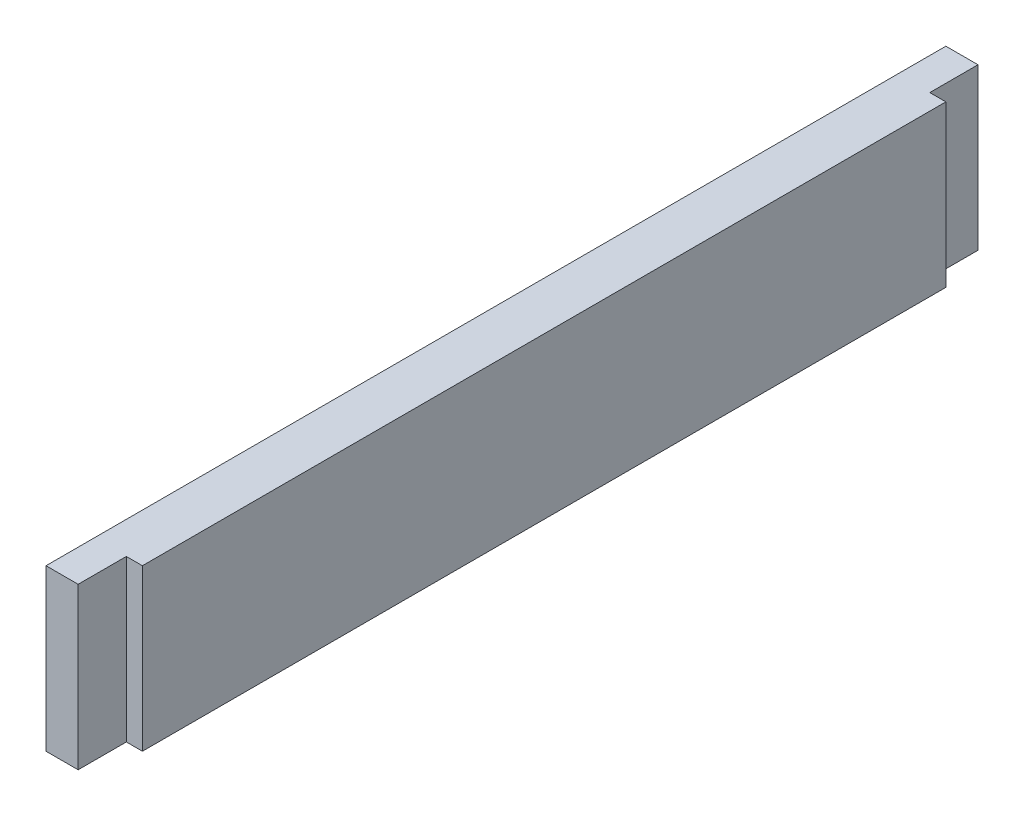
ISO-10303-21;
HEADER;
FILE_DESCRIPTION(('STEP AP214'),'2;1');
FILE_NAME('part.step','',(''),(''),'','','');
FILE_SCHEMA(('AUTOMOTIVE_DESIGN { 1 0 10303 214 1 1 1 1 }'));
ENDSEC;
DATA;
#1=APPLICATION_CONTEXT('core data for automotive mechanical design processes');
#2=APPLICATION_PROTOCOL_DEFINITION('international standard','automotive_design',2000,#1);
#3=PRODUCT_CONTEXT('',#1,'mechanical');
#4=PRODUCT('Part','Part','',(#3));
#5=PRODUCT_RELATED_PRODUCT_CATEGORY('part','',(#4));
#6=PRODUCT_DEFINITION_FORMATION('','',#4);
#7=PRODUCT_DEFINITION_CONTEXT('part definition',#1,'design');
#8=PRODUCT_DEFINITION('design','',#6,#7);
#9=PRODUCT_DEFINITION_SHAPE('','',#8);
#10=(LENGTH_UNIT() NAMED_UNIT(*) SI_UNIT(.MILLI.,.METRE.));
#11=(NAMED_UNIT(*) PLANE_ANGLE_UNIT() SI_UNIT($,.RADIAN.));
#12=(NAMED_UNIT(*) SI_UNIT($,.STERADIAN.) SOLID_ANGLE_UNIT());
#13=UNCERTAINTY_MEASURE_WITH_UNIT(LENGTH_MEASURE(1.E-05),#10,'distance_accuracy_value','');
#14=(GEOMETRIC_REPRESENTATION_CONTEXT(3) GLOBAL_UNCERTAINTY_ASSIGNED_CONTEXT((#13)) GLOBAL_UNIT_ASSIGNED_CONTEXT((#10,
#11,#12)) REPRESENTATION_CONTEXT('',''));
#15=CARTESIAN_POINT('',(0.,0.,0.));
#16=DIRECTION('',(0.,0.,1.));
#17=DIRECTION('',(1.,0.,0.));
#18=AXIS2_PLACEMENT_3D('',#15,#16,#17);
#19=CARTESIAN_POINT('',(-171.45,15.875,-88.9));
#20=DIRECTION('',(0.,0.,1.));
#21=DIRECTION('',(1.,0.,0.));
#22=AXIS2_PLACEMENT_3D('',#19,#20,#21);
#23=PLANE('',#22);
#24=DIRECTION('',(0.,-1.,0.));
#25=VECTOR('',#24,1.);
#26=CARTESIAN_POINT('',(-165.1,15.875,-88.9));
#27=LINE('',#26,#25);
#28=CARTESIAN_POINT('',(-165.1,15.875,-88.9));
#29=VERTEX_POINT('',#28);
#30=CARTESIAN_POINT('',(-165.1,-15.875,-88.9));
#31=VERTEX_POINT('',#30);
#32=EDGE_CURVE('E117',#29,#31,#27,.T.);
#33=ORIENTED_EDGE('',*,*,#32,.T.);
#34=DIRECTION('',(-1.,0.,0.));
#35=VECTOR('',#34,1.);
#36=CARTESIAN_POINT('',(-171.45,-15.875,-88.9));
#37=LINE('',#36,#35);
#38=CARTESIAN_POINT('',(-171.45,-15.875,-88.9));
#39=VERTEX_POINT('',#38);
#40=EDGE_CURVE('E111',#31,#39,#37,.T.);
#41=ORIENTED_EDGE('',*,*,#40,.T.);
#42=DIRECTION('',(0.,-1.,0.));
#43=VECTOR('',#42,1.);
#44=CARTESIAN_POINT('',(-171.45,15.875,-88.9));
#45=LINE('',#44,#43);
#46=CARTESIAN_POINT('',(-171.45,15.875,-88.9));
#47=VERTEX_POINT('',#46);
#48=EDGE_CURVE('E11',#47,#39,#45,.T.);
#49=ORIENTED_EDGE('',*,*,#48,.F.);
#50=DIRECTION('',(-1.,0.,0.));
#51=VECTOR('',#50,1.);
#52=CARTESIAN_POINT('',(-171.45,15.875,-88.9));
#53=LINE('',#52,#51);
#54=EDGE_CURVE('E135',#29,#47,#53,.T.);
#55=ORIENTED_EDGE('',*,*,#54,.F.);
#56=EDGE_LOOP('',(#33,#41,#49,#55));
#57=FACE_BOUND('',#56,.T.);
#58=ADVANCED_FACE('F35',(#57),#23,.F.);
#59=CARTESIAN_POINT('',(-171.45,15.875,-88.9));
#60=DIRECTION('',(1.,0.,0.));
#61=DIRECTION('',(0.,0.,-1.));
#62=AXIS2_PLACEMENT_3D('',#59,#60,#61);
#63=PLANE('',#62);
#64=ORIENTED_EDGE('',*,*,#48,.T.);
#65=DIRECTION('',(0.,0.,1.));
#66=VECTOR('',#65,1.);
#67=CARTESIAN_POINT('',(-171.45,-15.875,-88.9));
#68=LINE('',#67,#66);
#69=CARTESIAN_POINT('',(-171.45,-15.875,88.9));
#70=VERTEX_POINT('',#69);
#71=EDGE_CURVE('E101',#39,#70,#68,.T.);
#72=ORIENTED_EDGE('',*,*,#71,.T.);
#73=DIRECTION('',(0.,-1.,0.));
#74=VECTOR('',#73,1.);
#75=CARTESIAN_POINT('',(-171.45,15.875,88.9));
#76=LINE('',#75,#74);
#77=CARTESIAN_POINT('',(-171.45,15.875,88.9));
#78=VERTEX_POINT('',#77);
#79=EDGE_CURVE('E42',#78,#70,#76,.T.);
#80=ORIENTED_EDGE('',*,*,#79,.F.);
#81=DIRECTION('',(0.,0.,1.));
#82=VECTOR('',#81,1.);
#83=CARTESIAN_POINT('',(-171.45,15.875,-88.9));
#84=LINE('',#83,#82);
#85=EDGE_CURVE('E102',#47,#78,#84,.T.);
#86=ORIENTED_EDGE('',*,*,#85,.F.);
#87=EDGE_LOOP('',(#64,#72,#80,#86));
#88=FACE_BOUND('',#87,.T.);
#89=ADVANCED_FACE('F99',(#88),#63,.F.);
#90=CARTESIAN_POINT('',(-165.1,15.875,88.9));
#91=DIRECTION('',(0.,0.,-1.));
#92=DIRECTION('',(-1.,0.,0.));
#93=AXIS2_PLACEMENT_3D('',#90,#91,#92);
#94=PLANE('',#93);
#95=ORIENTED_EDGE('',*,*,#79,.T.);
#96=DIRECTION('',(1.,0.,0.));
#97=VECTOR('',#96,1.);
#98=CARTESIAN_POINT('',(-165.1,-15.875,88.9));
#99=LINE('',#98,#97);
#100=CARTESIAN_POINT('',(-165.1,-15.875,88.9));
#101=VERTEX_POINT('',#100);
#102=EDGE_CURVE('E115',#70,#101,#99,.T.);
#103=ORIENTED_EDGE('',*,*,#102,.T.);
#104=DIRECTION('',(0.,-1.,0.));
#105=VECTOR('',#104,1.);
#106=CARTESIAN_POINT('',(-165.1,15.875,88.9));
#107=LINE('',#106,#105);
#108=CARTESIAN_POINT('',(-165.1,15.875,88.9));
#109=VERTEX_POINT('',#108);
#110=EDGE_CURVE('E157',#109,#101,#107,.T.);
#111=ORIENTED_EDGE('',*,*,#110,.F.);
#112=DIRECTION('',(1.,0.,0.));
#113=VECTOR('',#112,1.);
#114=CARTESIAN_POINT('',(-165.1,15.875,88.9));
#115=LINE('',#114,#113);
#116=EDGE_CURVE('E138',#78,#109,#115,.T.);
#117=ORIENTED_EDGE('',*,*,#116,.F.);
#118=EDGE_LOOP('',(#95,#103,#111,#117));
#119=FACE_BOUND('',#118,.T.);
#120=ADVANCED_FACE('F160',(#119),#94,.F.);
#121=CARTESIAN_POINT('',(-165.1,15.875,79.375));
#122=DIRECTION('',(-1.,0.,0.));
#123=DIRECTION('',(0.,0.,1.));
#124=AXIS2_PLACEMENT_3D('',#121,#122,#123);
#125=PLANE('',#124);
#126=ORIENTED_EDGE('',*,*,#110,.T.);
#127=DIRECTION('',(0.,0.,-1.));
#128=VECTOR('',#127,1.);
#129=CARTESIAN_POINT('',(-165.1,-15.875,79.375));
#130=LINE('',#129,#128);
#131=CARTESIAN_POINT('',(-165.1,-15.875,79.375));
#132=VERTEX_POINT('',#131);
#133=EDGE_CURVE('E121',#101,#132,#130,.T.);
#134=ORIENTED_EDGE('',*,*,#133,.T.);
#135=DIRECTION('',(0.,-1.,0.));
#136=VECTOR('',#135,1.);
#137=CARTESIAN_POINT('',(-165.1,15.875,79.375));
#138=LINE('',#137,#136);
#139=CARTESIAN_POINT('',(-165.1,15.875,79.375));
#140=VERTEX_POINT('',#139);
#141=EDGE_CURVE('E155',#140,#132,#138,.T.);
#142=ORIENTED_EDGE('',*,*,#141,.F.);
#143=DIRECTION('',(0.,0.,-1.));
#144=VECTOR('',#143,1.);
#145=CARTESIAN_POINT('',(-165.1,15.875,79.375));
#146=LINE('',#145,#144);
#147=EDGE_CURVE('E140',#109,#140,#146,.T.);
#148=ORIENTED_EDGE('',*,*,#147,.F.);
#149=EDGE_LOOP('',(#126,#134,#142,#148));
#150=FACE_BOUND('',#149,.T.);
#151=ADVANCED_FACE('F168',(#150),#125,.F.);
#152=CARTESIAN_POINT('',(-161.925,15.875,79.375));
#153=DIRECTION('',(0.,0.,-1.));
#154=DIRECTION('',(-1.,0.,0.));
#155=AXIS2_PLACEMENT_3D('',#152,#153,#154);
#156=PLANE('',#155);
#157=ORIENTED_EDGE('',*,*,#141,.T.);
#158=DIRECTION('',(1.,0.,0.));
#159=VECTOR('',#158,1.);
#160=CARTESIAN_POINT('',(-161.925,-15.875,79.375));
#161=LINE('',#160,#159);
#162=CARTESIAN_POINT('',(-161.925,-15.875,79.375));
#163=VERTEX_POINT('',#162);
#164=EDGE_CURVE('E124',#132,#163,#161,.T.);
#165=ORIENTED_EDGE('',*,*,#164,.T.);
#166=DIRECTION('',(0.,-1.,0.));
#167=VECTOR('',#166,1.);
#168=CARTESIAN_POINT('',(-161.925,15.875,79.375));
#169=LINE('',#168,#167);
#170=CARTESIAN_POINT('',(-161.925,15.875,79.375));
#171=VERTEX_POINT('',#170);
#172=EDGE_CURVE('E153',#171,#163,#169,.T.);
#173=ORIENTED_EDGE('',*,*,#172,.F.);
#174=DIRECTION('',(1.,0.,0.));
#175=VECTOR('',#174,1.);
#176=CARTESIAN_POINT('',(-161.925,15.875,79.375));
#177=LINE('',#176,#175);
#178=EDGE_CURVE('E142',#140,#171,#177,.T.);
#179=ORIENTED_EDGE('',*,*,#178,.F.);
#180=EDGE_LOOP('',(#157,#165,#173,#179));
#181=FACE_BOUND('',#180,.T.);
#182=ADVANCED_FACE('F171',(#181),#156,.F.);
#183=CARTESIAN_POINT('',(-161.925,15.875,-79.375));
#184=DIRECTION('',(-1.,0.,0.));
#185=DIRECTION('',(0.,0.,1.));
#186=AXIS2_PLACEMENT_3D('',#183,#184,#185);
#187=PLANE('',#186);
#188=ORIENTED_EDGE('',*,*,#172,.T.);
#189=DIRECTION('',(0.,0.,-1.));
#190=VECTOR('',#189,1.);
#191=CARTESIAN_POINT('',(-161.925,-15.875,-25.4));
#192=LINE('',#191,#190);
#193=CARTESIAN_POINT('',(-161.925,-15.875,-79.375));
#194=VERTEX_POINT('',#193);
#195=EDGE_CURVE('E127',#163,#194,#192,.T.);
#196=ORIENTED_EDGE('',*,*,#195,.T.);
#197=DIRECTION('',(0.,-1.,0.));
#198=VECTOR('',#197,1.);
#199=CARTESIAN_POINT('',(-161.925,15.875,-79.375));
#200=LINE('',#199,#198);
#201=CARTESIAN_POINT('',(-161.925,15.875,-79.375));
#202=VERTEX_POINT('',#201);
#203=EDGE_CURVE('E151',#202,#194,#200,.T.);
#204=ORIENTED_EDGE('',*,*,#203,.F.);
#205=DIRECTION('',(0.,0.,-1.));
#206=VECTOR('',#205,1.);
#207=CARTESIAN_POINT('',(-161.925,15.875,-25.4));
#208=LINE('',#207,#206);
#209=EDGE_CURVE('E144',#171,#202,#208,.T.);
#210=ORIENTED_EDGE('',*,*,#209,.F.);
#211=EDGE_LOOP('',(#188,#196,#204,#210));
#212=FACE_BOUND('',#211,.T.);
#213=ADVANCED_FACE('F176',(#212),#187,.F.);
#214=CARTESIAN_POINT('',(-165.1,15.875,-79.375));
#215=DIRECTION('',(0.,0.,1.));
#216=DIRECTION('',(1.,0.,0.));
#217=AXIS2_PLACEMENT_3D('',#214,#215,#216);
#218=PLANE('',#217);
#219=ORIENTED_EDGE('',*,*,#203,.T.);
#220=DIRECTION('',(-1.,0.,0.));
#221=VECTOR('',#220,1.);
#222=CARTESIAN_POINT('',(-165.1,-15.875,-79.375));
#223=LINE('',#222,#221);
#224=CARTESIAN_POINT('',(-165.1,-15.875,-79.375));
#225=VERTEX_POINT('',#224);
#226=EDGE_CURVE('E130',#194,#225,#223,.T.);
#227=ORIENTED_EDGE('',*,*,#226,.T.);
#228=DIRECTION('',(0.,-1.,0.));
#229=VECTOR('',#228,1.);
#230=CARTESIAN_POINT('',(-165.1,15.875,-79.375));
#231=LINE('',#230,#229);
#232=CARTESIAN_POINT('',(-165.1,15.875,-79.375));
#233=VERTEX_POINT('',#232);
#234=EDGE_CURVE('E149',#233,#225,#231,.T.);
#235=ORIENTED_EDGE('',*,*,#234,.F.);
#236=DIRECTION('',(-1.,0.,0.));
#237=VECTOR('',#236,1.);
#238=CARTESIAN_POINT('',(-165.1,15.875,-79.375));
#239=LINE('',#238,#237);
#240=EDGE_CURVE('E54',#202,#233,#239,.T.);
#241=ORIENTED_EDGE('',*,*,#240,.F.);
#242=EDGE_LOOP('',(#219,#227,#235,#241));
#243=FACE_BOUND('',#242,.T.);
#244=ADVANCED_FACE('F179',(#243),#218,.F.);
#245=CARTESIAN_POINT('',(-165.1,15.875,-88.9));
#246=DIRECTION('',(-1.,0.,0.));
#247=DIRECTION('',(0.,0.,1.));
#248=AXIS2_PLACEMENT_3D('',#245,#246,#247);
#249=PLANE('',#248);
#250=ORIENTED_EDGE('',*,*,#234,.T.);
#251=DIRECTION('',(0.,0.,-1.));
#252=VECTOR('',#251,1.);
#253=CARTESIAN_POINT('',(-165.1,-15.875,-88.9));
#254=LINE('',#253,#252);
#255=EDGE_CURVE('E133',#225,#31,#254,.T.);
#256=ORIENTED_EDGE('',*,*,#255,.T.);
#257=ORIENTED_EDGE('',*,*,#32,.F.);
#258=DIRECTION('',(0.,0.,-1.));
#259=VECTOR('',#258,1.);
#260=CARTESIAN_POINT('',(-165.1,15.875,-88.9));
#261=LINE('',#260,#259);
#262=EDGE_CURVE('E49',#233,#29,#261,.T.);
#263=ORIENTED_EDGE('',*,*,#262,.F.);
#264=EDGE_LOOP('',(#250,#256,#257,#263));
#265=FACE_BOUND('',#264,.T.);
#266=ADVANCED_FACE('F181',(#265),#249,.F.);
#267=CARTESIAN_POINT('',(-165.1,15.875,-88.9));
#268=DIRECTION('',(0.,-1.,0.));
#269=DIRECTION('',(0.,0.,-1.));
#270=AXIS2_PLACEMENT_3D('',#267,#268,#269);
#271=PLANE('',#270);
#272=ORIENTED_EDGE('',*,*,#54,.T.);
#273=ORIENTED_EDGE('',*,*,#85,.T.);
#274=ORIENTED_EDGE('',*,*,#116,.T.);
#275=ORIENTED_EDGE('',*,*,#147,.T.);
#276=ORIENTED_EDGE('',*,*,#178,.T.);
#277=ORIENTED_EDGE('',*,*,#209,.T.);
#278=ORIENTED_EDGE('',*,*,#240,.T.);
#279=ORIENTED_EDGE('',*,*,#262,.T.);
#280=EDGE_LOOP('',(#272,#273,#274,#275,#276,#277,#278,#279));
#281=FACE_BOUND('',#280,.T.);
#282=ADVANCED_FACE('F163',(#281),#271,.F.);
#283=CARTESIAN_POINT('',(-165.1,-15.875,-88.9));
#284=DIRECTION('',(0.,-1.,0.));
#285=DIRECTION('',(0.,0.,-1.));
#286=AXIS2_PLACEMENT_3D('',#283,#284,#285);
#287=PLANE('',#286);
#288=ORIENTED_EDGE('',*,*,#40,.F.);
#289=ORIENTED_EDGE('',*,*,#255,.F.);
#290=ORIENTED_EDGE('',*,*,#226,.F.);
#291=ORIENTED_EDGE('',*,*,#195,.F.);
#292=ORIENTED_EDGE('',*,*,#164,.F.);
#293=ORIENTED_EDGE('',*,*,#133,.F.);
#294=ORIENTED_EDGE('',*,*,#102,.F.);
#295=ORIENTED_EDGE('',*,*,#71,.F.);
#296=EDGE_LOOP('',(#288,#289,#290,#291,#292,#293,#294,#295));
#297=FACE_BOUND('',#296,.T.);
#298=ADVANCED_FACE('F109',(#297),#287,.T.);
#299=CLOSED_SHELL('',(#58,#89,#120,#151,#182,#213,#244,#266,#282,#298));
#300=MANIFOLD_SOLID_BREP('B2',#299);
#301=ADVANCED_BREP_SHAPE_REPRESENTATION('',(#18,#300),#14);
#302=SHAPE_DEFINITION_REPRESENTATION(#9,#301);
ENDSEC;
END-ISO-10303-21;
